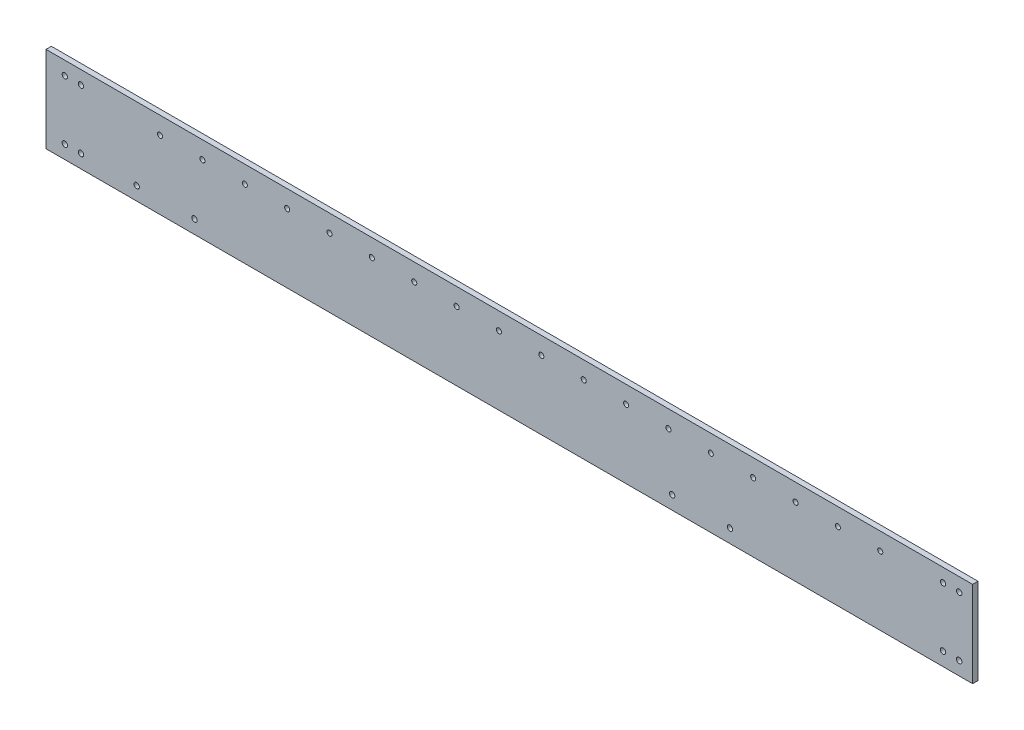
ISO-10303-21;
HEADER;
FILE_DESCRIPTION(('STEP AP214'),'2;1');
FILE_NAME('part.step','',(''),(''),'','','');
FILE_SCHEMA(('AUTOMOTIVE_DESIGN { 1 0 10303 214 1 1 1 1 }'));
ENDSEC;
DATA;
#1=APPLICATION_CONTEXT('core data for automotive mechanical design processes');
#2=APPLICATION_PROTOCOL_DEFINITION('international standard','automotive_design',2000,#1);
#3=PRODUCT_CONTEXT('',#1,'mechanical');
#4=PRODUCT('Part','Part','',(#3));
#5=PRODUCT_RELATED_PRODUCT_CATEGORY('part','',(#4));
#6=PRODUCT_DEFINITION_FORMATION('','',#4);
#7=PRODUCT_DEFINITION_CONTEXT('part definition',#1,'design');
#8=PRODUCT_DEFINITION('design','',#6,#7);
#9=PRODUCT_DEFINITION_SHAPE('','',#8);
#10=(LENGTH_UNIT() NAMED_UNIT(*) SI_UNIT(.MILLI.,.METRE.));
#11=(NAMED_UNIT(*) PLANE_ANGLE_UNIT() SI_UNIT($,.RADIAN.));
#12=(NAMED_UNIT(*) SI_UNIT($,.STERADIAN.) SOLID_ANGLE_UNIT());
#13=UNCERTAINTY_MEASURE_WITH_UNIT(LENGTH_MEASURE(1.E-05),#10,'distance_accuracy_value','');
#14=(GEOMETRIC_REPRESENTATION_CONTEXT(3) GLOBAL_UNCERTAINTY_ASSIGNED_CONTEXT((#13)) GLOBAL_UNIT_ASSIGNED_CONTEXT((#10,
#11,#12)) REPRESENTATION_CONTEXT('',''));
#15=CARTESIAN_POINT('',(0.,0.,0.));
#16=DIRECTION('',(0.,0.,1.));
#17=DIRECTION('',(1.,0.,0.));
#18=AXIS2_PLACEMENT_3D('',#15,#16,#17);
#19=CARTESIAN_POINT('',(546.825,50.8,0.));
#20=DIRECTION('',(0.,0.,1.));
#21=DIRECTION('',(0.,-1.,0.));
#22=AXIS2_PLACEMENT_3D('',#19,#20,#21);
#23=PLANE('',#22);
#24=CARTESIAN_POINT('',(292.325,40.5749999999986,0.));
#25=DIRECTION('',(0.,0.,1.));
#26=DIRECTION('',(1.,0.,0.));
#27=AXIS2_PLACEMENT_3D('',#24,#25,#26);
#28=CIRCLE('',#27,1.50000000000002);
#29=CARTESIAN_POINT('',(293.825,40.5749999999986,0.));
#30=VERTEX_POINT('',#29);
#31=EDGE_CURVE('E167',#30,#30,#28,.T.);
#32=ORIENTED_EDGE('',*,*,#31,.T.);
#33=EDGE_LOOP('',(#32));
#34=FACE_BOUND('',#33,.T.);
#35=CARTESIAN_POINT('',(317.325,40.5749999999988,0.));
#36=DIRECTION('',(0.,0.,1.));
#37=DIRECTION('',(1.,0.,0.));
#38=AXIS2_PLACEMENT_3D('',#35,#36,#37);
#39=CIRCLE('',#38,1.50000000000002);
#40=CARTESIAN_POINT('',(318.825,40.5749999999988,0.));
#41=VERTEX_POINT('',#40);
#42=EDGE_CURVE('E174',#41,#41,#39,.T.);
#43=ORIENTED_EDGE('',*,*,#42,.T.);
#44=EDGE_LOOP('',(#43));
#45=FACE_BOUND('',#44,.T.);
#46=CARTESIAN_POINT('',(342.325,40.574999999999,0.));
#47=DIRECTION('',(0.,0.,1.));
#48=DIRECTION('',(1.,0.,0.));
#49=AXIS2_PLACEMENT_3D('',#46,#47,#48);
#50=CIRCLE('',#49,1.50000000000002);
#51=CARTESIAN_POINT('',(343.825,40.574999999999,0.));
#52=VERTEX_POINT('',#51);
#53=EDGE_CURVE('E180',#52,#52,#50,.T.);
#54=ORIENTED_EDGE('',*,*,#53,.T.);
#55=EDGE_LOOP('',(#54));
#56=FACE_BOUND('',#55,.T.);
#57=CARTESIAN_POINT('',(367.325,40.5749999999991,0.));
#58=DIRECTION('',(0.,0.,1.));
#59=DIRECTION('',(1.,0.,0.));
#60=AXIS2_PLACEMENT_3D('',#57,#58,#59);
#61=CIRCLE('',#60,1.50000000000002);
#62=CARTESIAN_POINT('',(368.825,40.5749999999991,0.));
#63=VERTEX_POINT('',#62);
#64=EDGE_CURVE('E186',#63,#63,#61,.T.);
#65=ORIENTED_EDGE('',*,*,#64,.T.);
#66=EDGE_LOOP('',(#65));
#67=FACE_BOUND('',#66,.T.);
#68=CARTESIAN_POINT('',(392.325,40.5749999999993,0.));
#69=DIRECTION('',(0.,0.,1.));
#70=DIRECTION('',(1.,0.,0.));
#71=AXIS2_PLACEMENT_3D('',#68,#69,#70);
#72=CIRCLE('',#71,1.50000000000008);
#73=CARTESIAN_POINT('',(393.825,40.5749999999993,0.));
#74=VERTEX_POINT('',#73);
#75=EDGE_CURVE('E192',#74,#74,#72,.T.);
#76=ORIENTED_EDGE('',*,*,#75,.T.);
#77=EDGE_LOOP('',(#76));
#78=FACE_BOUND('',#77,.T.);
#79=CARTESIAN_POINT('',(417.325,40.5749999999995,0.));
#80=DIRECTION('',(0.,0.,1.));
#81=DIRECTION('',(1.,0.,0.));
#82=AXIS2_PLACEMENT_3D('',#79,#80,#81);
#83=CIRCLE('',#82,1.50000000000002);
#84=CARTESIAN_POINT('',(418.825,40.5749999999995,0.));
#85=VERTEX_POINT('',#84);
#86=EDGE_CURVE('E198',#85,#85,#83,.T.);
#87=ORIENTED_EDGE('',*,*,#86,.T.);
#88=EDGE_LOOP('',(#87));
#89=FACE_BOUND('',#88,.T.);
#90=CARTESIAN_POINT('',(442.325,40.5749999999997,0.));
#91=DIRECTION('',(0.,0.,1.));
#92=DIRECTION('',(1.,0.,0.));
#93=AXIS2_PLACEMENT_3D('',#90,#91,#92);
#94=CIRCLE('',#93,1.50000000000002);
#95=CARTESIAN_POINT('',(443.825,40.5749999999997,0.));
#96=VERTEX_POINT('',#95);
#97=EDGE_CURVE('E204',#96,#96,#94,.T.);
#98=ORIENTED_EDGE('',*,*,#97,.T.);
#99=EDGE_LOOP('',(#98));
#100=FACE_BOUND('',#99,.T.);
#101=CARTESIAN_POINT('',(467.325,40.5749999999998,0.));
#102=DIRECTION('',(0.,0.,1.));
#103=DIRECTION('',(1.,0.,0.));
#104=AXIS2_PLACEMENT_3D('',#101,#102,#103);
#105=CIRCLE('',#104,1.50000000000002);
#106=CARTESIAN_POINT('',(468.825,40.5749999999998,0.));
#107=VERTEX_POINT('',#106);
#108=EDGE_CURVE('E210',#107,#107,#105,.T.);
#109=ORIENTED_EDGE('',*,*,#108,.T.);
#110=EDGE_LOOP('',(#109));
#111=FACE_BOUND('',#110,.T.);
#112=CARTESIAN_POINT('',(538.8875,42.8625,0.));
#113=DIRECTION('',(0.,0.,1.));
#114=DIRECTION('',(1.,0.,0.));
#115=AXIS2_PLACEMENT_3D('',#112,#113,#114);
#116=CIRCLE('',#115,1.58750000000004);
#117=CARTESIAN_POINT('',(540.475,42.8625,0.));
#118=VERTEX_POINT('',#117);
#119=EDGE_CURVE('E138',#118,#118,#116,.T.);
#120=ORIENTED_EDGE('',*,*,#119,.T.);
#121=EDGE_LOOP('',(#120));
#122=FACE_BOUND('',#121,.T.);
#123=CARTESIAN_POINT('',(529.3625,42.8625,0.));
#124=DIRECTION('',(0.,0.,1.));
#125=DIRECTION('',(1.,0.,0.));
#126=AXIS2_PLACEMENT_3D('',#123,#124,#125);
#127=CIRCLE('',#126,1.58750000000004);
#128=CARTESIAN_POINT('',(530.95,42.8625,0.));
#129=VERTEX_POINT('',#128);
#130=EDGE_CURVE('E132',#129,#129,#127,.T.);
#131=ORIENTED_EDGE('',*,*,#130,.T.);
#132=EDGE_LOOP('',(#131));
#133=FACE_BOUND('',#132,.T.);
#134=CARTESIAN_POINT('',(20.6375,42.8625,0.));
#135=DIRECTION('',(0.,0.,1.));
#136=DIRECTION('',(1.,0.,0.));
#137=AXIS2_PLACEMENT_3D('',#134,#135,#136);
#138=CIRCLE('',#137,1.5875);
#139=CARTESIAN_POINT('',(22.225,42.8625,0.));
#140=VERTEX_POINT('',#139);
#141=EDGE_CURVE('E126',#140,#140,#138,.T.);
#142=ORIENTED_EDGE('',*,*,#141,.T.);
#143=EDGE_LOOP('',(#142));
#144=FACE_BOUND('',#143,.T.);
#145=CARTESIAN_POINT('',(11.1125,7.9375,0.));
#146=DIRECTION('',(0.,0.,1.));
#147=DIRECTION('',(1.,0.,0.));
#148=AXIS2_PLACEMENT_3D('',#145,#146,#147);
#149=CIRCLE('',#148,1.5875);
#150=CARTESIAN_POINT('',(12.7,7.9375,0.));
#151=VERTEX_POINT('',#150);
#152=EDGE_CURVE('E119',#151,#151,#149,.T.);
#153=ORIENTED_EDGE('',*,*,#152,.T.);
#154=EDGE_LOOP('',(#153));
#155=FACE_BOUND('',#154,.T.);
#156=CARTESIAN_POINT('',(492.325,40.575,0.));
#157=DIRECTION('',(0.,0.,1.));
#158=DIRECTION('',(1.,0.,0.));
#159=AXIS2_PLACEMENT_3D('',#156,#157,#158);
#160=CIRCLE('',#159,1.50000000000002);
#161=CARTESIAN_POINT('',(493.825,40.575,0.));
#162=VERTEX_POINT('',#161);
#163=EDGE_CURVE('E155',#162,#162,#160,.T.);
#164=ORIENTED_EDGE('',*,*,#163,.T.);
#165=EDGE_LOOP('',(#164));
#166=FACE_BOUND('',#165,.T.);
#167=CARTESIAN_POINT('',(538.8875,7.9375,0.));
#168=DIRECTION('',(0.,0.,1.));
#169=DIRECTION('',(1.,0.,0.));
#170=AXIS2_PLACEMENT_3D('',#167,#168,#169);
#171=CIRCLE('',#170,1.58750000000005);
#172=CARTESIAN_POINT('',(540.475,7.9375,0.));
#173=VERTEX_POINT('',#172);
#174=EDGE_CURVE('E162',#173,#173,#171,.T.);
#175=ORIENTED_EDGE('',*,*,#174,.T.);
#176=EDGE_LOOP('',(#175));
#177=FACE_BOUND('',#176,.T.);
#178=CARTESIAN_POINT('',(529.3625,7.9375,0.));
#179=DIRECTION('',(0.,0.,1.));
#180=DIRECTION('',(1.,0.,0.));
#181=AXIS2_PLACEMENT_3D('',#178,#179,#180);
#182=CIRCLE('',#181,1.58750000000005);
#183=CARTESIAN_POINT('',(530.95,7.9375,0.));
#184=VERTEX_POINT('',#183);
#185=EDGE_CURVE('E143',#184,#184,#182,.T.);
#186=ORIENTED_EDGE('',*,*,#185,.T.);
#187=EDGE_LOOP('',(#186));
#188=FACE_BOUND('',#187,.T.);
#189=CARTESIAN_POINT('',(20.6375,7.9375,0.));
#190=DIRECTION('',(0.,0.,1.));
#191=DIRECTION('',(1.,0.,0.));
#192=AXIS2_PLACEMENT_3D('',#189,#190,#191);
#193=CIRCLE('',#192,1.5875);
#194=CARTESIAN_POINT('',(22.225,7.9375,0.));
#195=VERTEX_POINT('',#194);
#196=EDGE_CURVE('E150',#195,#195,#193,.T.);
#197=ORIENTED_EDGE('',*,*,#196,.T.);
#198=EDGE_LOOP('',(#197));
#199=FACE_BOUND('',#198,.T.);
#200=CARTESIAN_POINT('',(403.6375,7.9375,0.));
#201=DIRECTION('',(0.,0.,1.));
#202=DIRECTION('',(1.,0.,0.));
#203=AXIS2_PLACEMENT_3D('',#200,#201,#202);
#204=CIRCLE('',#203,1.58750000000004);
#205=CARTESIAN_POINT('',(405.225,7.9375,0.));
#206=VERTEX_POINT('',#205);
#207=EDGE_CURVE('E263',#206,#206,#204,.T.);
#208=ORIENTED_EDGE('',*,*,#207,.T.);
#209=EDGE_LOOP('',(#208));
#210=FACE_BOUND('',#209,.T.);
#211=CARTESIAN_POINT('',(87.6375,7.9375,0.));
#212=DIRECTION('',(0.,0.,1.));
#213=DIRECTION('',(1.,0.,0.));
#214=AXIS2_PLACEMENT_3D('',#211,#212,#213);
#215=CIRCLE('',#214,1.5875);
#216=CARTESIAN_POINT('',(89.225,7.9375,0.));
#217=VERTEX_POINT('',#216);
#218=EDGE_CURVE('E269',#217,#217,#215,.T.);
#219=ORIENTED_EDGE('',*,*,#218,.T.);
#220=EDGE_LOOP('',(#219));
#221=FACE_BOUND('',#220,.T.);
#222=CARTESIAN_POINT('',(369.5125,7.9375,0.));
#223=DIRECTION('',(0.,0.,1.));
#224=DIRECTION('',(1.,0.,0.));
#225=AXIS2_PLACEMENT_3D('',#222,#223,#224);
#226=CIRCLE('',#225,1.58750000000004);
#227=CARTESIAN_POINT('',(371.1,7.9375,0.));
#228=VERTEX_POINT('',#227);
#229=EDGE_CURVE('E275',#228,#228,#226,.T.);
#230=ORIENTED_EDGE('',*,*,#229,.T.);
#231=EDGE_LOOP('',(#230));
#232=FACE_BOUND('',#231,.T.);
#233=CARTESIAN_POINT('',(67.3249999999996,40.574999999997,0.));
#234=DIRECTION('',(0.,0.,1.));
#235=DIRECTION('',(1.,0.,0.));
#236=AXIS2_PLACEMENT_3D('',#233,#234,#235);
#237=CIRCLE('',#236,1.50000000000003);
#238=CARTESIAN_POINT('',(68.8249999999997,40.574999999997,0.));
#239=VERTEX_POINT('',#238);
#240=EDGE_CURVE('E281',#239,#239,#237,.T.);
#241=ORIENTED_EDGE('',*,*,#240,.T.);
#242=EDGE_LOOP('',(#241));
#243=FACE_BOUND('',#242,.T.);
#244=CARTESIAN_POINT('',(92.3249999999997,40.5749999999972,0.));
#245=DIRECTION('',(0.,0.,1.));
#246=DIRECTION('',(1.,0.,0.));
#247=AXIS2_PLACEMENT_3D('',#244,#245,#246);
#248=CIRCLE('',#247,1.50000000000003);
#249=CARTESIAN_POINT('',(93.8249999999997,40.5749999999972,0.));
#250=VERTEX_POINT('',#249);
#251=EDGE_CURVE('E287',#250,#250,#248,.T.);
#252=ORIENTED_EDGE('',*,*,#251,.T.);
#253=EDGE_LOOP('',(#252));
#254=FACE_BOUND('',#253,.T.);
#255=CARTESIAN_POINT('',(167.325,40.5749999999977,0.));
#256=DIRECTION('',(0.,0.,1.));
#257=DIRECTION('',(1.,0.,0.));
#258=AXIS2_PLACEMENT_3D('',#255,#256,#257);
#259=CIRCLE('',#258,1.50000000000003);
#260=CARTESIAN_POINT('',(168.825,40.5749999999977,0.));
#261=VERTEX_POINT('',#260);
#262=EDGE_CURVE('E222',#261,#261,#259,.T.);
#263=ORIENTED_EDGE('',*,*,#262,.T.);
#264=EDGE_LOOP('',(#263));
#265=FACE_BOUND('',#264,.T.);
#266=CARTESIAN_POINT('',(53.5125,7.9375,0.));
#267=DIRECTION('',(0.,0.,1.));
#268=DIRECTION('',(1.,0.,0.));
#269=AXIS2_PLACEMENT_3D('',#266,#267,#268);
#270=CIRCLE('',#269,1.5875);
#271=CARTESIAN_POINT('',(55.1,7.9375,0.));
#272=VERTEX_POINT('',#271);
#273=EDGE_CURVE('E215',#272,#272,#270,.T.);
#274=ORIENTED_EDGE('',*,*,#273,.T.);
#275=EDGE_LOOP('',(#274));
#276=FACE_BOUND('',#275,.T.);
#277=CARTESIAN_POINT('',(142.325,40.5749999999976,0.));
#278=DIRECTION('',(0.,0.,1.));
#279=DIRECTION('',(1.,0.,0.));
#280=AXIS2_PLACEMENT_3D('',#277,#278,#279);
#281=CIRCLE('',#280,1.50000000000003);
#282=CARTESIAN_POINT('',(143.825,40.5749999999976,0.));
#283=VERTEX_POINT('',#282);
#284=EDGE_CURVE('E236',#283,#283,#281,.T.);
#285=ORIENTED_EDGE('',*,*,#284,.T.);
#286=EDGE_LOOP('',(#285));
#287=FACE_BOUND('',#286,.T.);
#288=CARTESIAN_POINT('',(117.325,40.5749999999974,0.));
#289=DIRECTION('',(0.,0.,1.));
#290=DIRECTION('',(1.,0.,0.));
#291=AXIS2_PLACEMENT_3D('',#288,#289,#290);
#292=CIRCLE('',#291,1.50000000000003);
#293=CARTESIAN_POINT('',(118.825,40.5749999999974,0.));
#294=VERTEX_POINT('',#293);
#295=EDGE_CURVE('E229',#294,#294,#292,.T.);
#296=ORIENTED_EDGE('',*,*,#295,.T.);
#297=EDGE_LOOP('',(#296));
#298=FACE_BOUND('',#297,.T.);
#299=CARTESIAN_POINT('',(192.325,40.5749999999979,0.));
#300=DIRECTION('',(0.,0.,1.));
#301=DIRECTION('',(1.,0.,0.));
#302=AXIS2_PLACEMENT_3D('',#299,#300,#301);
#303=CIRCLE('',#302,1.50000000000003);
#304=CARTESIAN_POINT('',(193.825,40.5749999999979,0.));
#305=VERTEX_POINT('',#304);
#306=EDGE_CURVE('E228',#305,#305,#303,.T.);
#307=ORIENTED_EDGE('',*,*,#306,.T.);
#308=EDGE_LOOP('',(#307));
#309=FACE_BOUND('',#308,.T.);
#310=CARTESIAN_POINT('',(217.325,40.5749999999981,0.));
#311=DIRECTION('',(0.,0.,1.));
#312=DIRECTION('',(1.,0.,0.));
#313=AXIS2_PLACEMENT_3D('',#310,#311,#312);
#314=CIRCLE('',#313,1.50000000000003);
#315=CARTESIAN_POINT('',(218.825,40.5749999999981,0.));
#316=VERTEX_POINT('',#315);
#317=EDGE_CURVE('E246',#316,#316,#314,.T.);
#318=ORIENTED_EDGE('',*,*,#317,.T.);
#319=EDGE_LOOP('',(#318));
#320=FACE_BOUND('',#319,.T.);
#321=CARTESIAN_POINT('',(242.325,40.5749999999983,0.));
#322=DIRECTION('',(0.,0.,1.));
#323=DIRECTION('',(1.,0.,0.));
#324=AXIS2_PLACEMENT_3D('',#321,#322,#323);
#325=CIRCLE('',#324,1.50000000000003);
#326=CARTESIAN_POINT('',(243.825,40.5749999999983,0.));
#327=VERTEX_POINT('',#326);
#328=EDGE_CURVE('E252',#327,#327,#325,.T.);
#329=ORIENTED_EDGE('',*,*,#328,.T.);
#330=EDGE_LOOP('',(#329));
#331=FACE_BOUND('',#330,.T.);
#332=CARTESIAN_POINT('',(267.325,40.5749999999984,0.));
#333=DIRECTION('',(0.,0.,1.));
#334=DIRECTION('',(1.,0.,0.));
#335=AXIS2_PLACEMENT_3D('',#332,#333,#334);
#336=CIRCLE('',#335,1.50000000000002);
#337=CARTESIAN_POINT('',(268.825,40.5749999999984,0.));
#338=VERTEX_POINT('',#337);
#339=EDGE_CURVE('E258',#338,#338,#336,.T.);
#340=ORIENTED_EDGE('',*,*,#339,.T.);
#341=EDGE_LOOP('',(#340));
#342=FACE_BOUND('',#341,.T.);
#343=CARTESIAN_POINT('',(11.1125,42.8625,0.));
#344=DIRECTION('',(0.,0.,1.));
#345=DIRECTION('',(1.,0.,0.));
#346=AXIS2_PLACEMENT_3D('',#343,#344,#345);
#347=CIRCLE('',#346,1.5875);
#348=CARTESIAN_POINT('',(12.7,42.8625,0.));
#349=VERTEX_POINT('',#348);
#350=EDGE_CURVE('E102',#349,#349,#347,.T.);
#351=ORIENTED_EDGE('',*,*,#350,.T.);
#352=EDGE_LOOP('',(#351));
#353=FACE_BOUND('',#352,.T.);
#354=DIRECTION('',(0.,1.,0.));
#355=VECTOR('',#354,1.);
#356=CARTESIAN_POINT('',(0.,50.8,0.));
#357=LINE('',#356,#355);
#358=CARTESIAN_POINT('',(0.,0.,0.));
#359=VERTEX_POINT('',#358);
#360=CARTESIAN_POINT('',(0.,50.8,0.));
#361=VERTEX_POINT('',#360);
#362=EDGE_CURVE('E99',#359,#361,#357,.T.);
#363=ORIENTED_EDGE('',*,*,#362,.T.);
#364=DIRECTION('',(-1.,0.,0.));
#365=VECTOR('',#364,1.);
#366=CARTESIAN_POINT('',(546.825,50.8,0.));
#367=LINE('',#366,#365);
#368=CARTESIAN_POINT('',(546.825,50.8,0.));
#369=VERTEX_POINT('',#368);
#370=EDGE_CURVE('E11',#369,#361,#367,.T.);
#371=ORIENTED_EDGE('',*,*,#370,.F.);
#372=DIRECTION('',(0.,1.,0.));
#373=VECTOR('',#372,1.);
#374=CARTESIAN_POINT('',(546.825,50.8,0.));
#375=LINE('',#374,#373);
#376=CARTESIAN_POINT('',(546.825,0.,0.));
#377=VERTEX_POINT('',#376);
#378=EDGE_CURVE('E87',#377,#369,#375,.T.);
#379=ORIENTED_EDGE('',*,*,#378,.F.);
#380=DIRECTION('',(-1.,0.,0.));
#381=VECTOR('',#380,1.);
#382=CARTESIAN_POINT('',(546.825,0.,0.));
#383=LINE('',#382,#381);
#384=EDGE_CURVE('E95',#377,#359,#383,.T.);
#385=ORIENTED_EDGE('',*,*,#384,.T.);
#386=EDGE_LOOP('',(#363,#371,#379,#385));
#387=FACE_BOUND('',#386,.T.);
#388=ADVANCED_FACE('F36',(#34,#45,#56,#67,#78,#89,#100,#111,#122,#133,#144,#155,#166,#177,#188,
#199,#210,#221,#232,#243,#254,#265,#276,#287,#298,#309,#320,#331,#342,#353,#387),#23,.F.);
#389=CARTESIAN_POINT('',(546.825,50.8,3.17499999999999));
#390=DIRECTION('',(0.,-1.,0.));
#391=DIRECTION('',(0.,0.,-1.));
#392=AXIS2_PLACEMENT_3D('',#389,#390,#391);
#393=PLANE('',#392);
#394=DIRECTION('',(0.,0.,1.));
#395=VECTOR('',#394,1.);
#396=CARTESIAN_POINT('',(0.,50.8,3.17499999999999));
#397=LINE('',#396,#395);
#398=CARTESIAN_POINT('',(0.,50.8,3.17499999999999));
#399=VERTEX_POINT('',#398);
#400=EDGE_CURVE('E91',#361,#399,#397,.T.);
#401=ORIENTED_EDGE('',*,*,#400,.T.);
#402=DIRECTION('',(-1.,0.,0.));
#403=VECTOR('',#402,1.);
#404=CARTESIAN_POINT('',(546.825,50.8,3.17499999999999));
#405=LINE('',#404,#403);
#406=CARTESIAN_POINT('',(546.825,50.8,3.17499999999999));
#407=VERTEX_POINT('',#406);
#408=EDGE_CURVE('E44',#407,#399,#405,.T.);
#409=ORIENTED_EDGE('',*,*,#408,.F.);
#410=DIRECTION('',(0.,0.,1.));
#411=VECTOR('',#410,1.);
#412=CARTESIAN_POINT('',(546.825,50.8,3.17499999999999));
#413=LINE('',#412,#411);
#414=EDGE_CURVE('E82',#369,#407,#413,.T.);
#415=ORIENTED_EDGE('',*,*,#414,.F.);
#416=ORIENTED_EDGE('',*,*,#370,.T.);
#417=EDGE_LOOP('',(#401,#409,#415,#416));
#418=FACE_BOUND('',#417,.T.);
#419=ADVANCED_FACE('F90',(#418),#393,.F.);
#420=CARTESIAN_POINT('',(546.825,0.,3.175));
#421=DIRECTION('',(0.,0.,-1.));
#422=DIRECTION('',(0.,1.,0.));
#423=AXIS2_PLACEMENT_3D('',#420,#421,#422);
#424=PLANE('',#423);
#425=CARTESIAN_POINT('',(292.325,40.5749999999986,3.175));
#426=DIRECTION('',(0.,0.,1.));
#427=DIRECTION('',(1.,0.,0.));
#428=AXIS2_PLACEMENT_3D('',#425,#426,#427);
#429=CIRCLE('',#428,1.50000000000002);
#430=CARTESIAN_POINT('',(293.825,40.5749999999986,3.175));
#431=VERTEX_POINT('',#430);
#432=EDGE_CURVE('E170',#431,#431,#429,.T.);
#433=ORIENTED_EDGE('',*,*,#432,.F.);
#434=EDGE_LOOP('',(#433));
#435=FACE_BOUND('',#434,.T.);
#436=CARTESIAN_POINT('',(317.325,40.5749999999988,3.175));
#437=DIRECTION('',(0.,0.,1.));
#438=DIRECTION('',(1.,0.,0.));
#439=AXIS2_PLACEMENT_3D('',#436,#437,#438);
#440=CIRCLE('',#439,1.50000000000002);
#441=CARTESIAN_POINT('',(318.825,40.5749999999988,3.175));
#442=VERTEX_POINT('',#441);
#443=EDGE_CURVE('E177',#442,#442,#440,.T.);
#444=ORIENTED_EDGE('',*,*,#443,.F.);
#445=EDGE_LOOP('',(#444));
#446=FACE_BOUND('',#445,.T.);
#447=CARTESIAN_POINT('',(342.325,40.574999999999,3.175));
#448=DIRECTION('',(0.,0.,1.));
#449=DIRECTION('',(1.,0.,0.));
#450=AXIS2_PLACEMENT_3D('',#447,#448,#449);
#451=CIRCLE('',#450,1.50000000000002);
#452=CARTESIAN_POINT('',(343.825,40.574999999999,3.175));
#453=VERTEX_POINT('',#452);
#454=EDGE_CURVE('E183',#453,#453,#451,.T.);
#455=ORIENTED_EDGE('',*,*,#454,.F.);
#456=EDGE_LOOP('',(#455));
#457=FACE_BOUND('',#456,.T.);
#458=CARTESIAN_POINT('',(367.325,40.5749999999991,3.175));
#459=DIRECTION('',(0.,0.,1.));
#460=DIRECTION('',(1.,0.,0.));
#461=AXIS2_PLACEMENT_3D('',#458,#459,#460);
#462=CIRCLE('',#461,1.50000000000002);
#463=CARTESIAN_POINT('',(368.825,40.5749999999991,3.175));
#464=VERTEX_POINT('',#463);
#465=EDGE_CURVE('E189',#464,#464,#462,.T.);
#466=ORIENTED_EDGE('',*,*,#465,.F.);
#467=EDGE_LOOP('',(#466));
#468=FACE_BOUND('',#467,.T.);
#469=CARTESIAN_POINT('',(392.325,40.5749999999993,3.175));
#470=DIRECTION('',(0.,0.,1.));
#471=DIRECTION('',(1.,0.,0.));
#472=AXIS2_PLACEMENT_3D('',#469,#470,#471);
#473=CIRCLE('',#472,1.50000000000008);
#474=CARTESIAN_POINT('',(393.825,40.5749999999993,3.175));
#475=VERTEX_POINT('',#474);
#476=EDGE_CURVE('E195',#475,#475,#473,.T.);
#477=ORIENTED_EDGE('',*,*,#476,.F.);
#478=EDGE_LOOP('',(#477));
#479=FACE_BOUND('',#478,.T.);
#480=CARTESIAN_POINT('',(417.325,40.5749999999995,3.175));
#481=DIRECTION('',(0.,0.,1.));
#482=DIRECTION('',(1.,0.,0.));
#483=AXIS2_PLACEMENT_3D('',#480,#481,#482);
#484=CIRCLE('',#483,1.50000000000002);
#485=CARTESIAN_POINT('',(418.825,40.5749999999995,3.175));
#486=VERTEX_POINT('',#485);
#487=EDGE_CURVE('E201',#486,#486,#484,.T.);
#488=ORIENTED_EDGE('',*,*,#487,.F.);
#489=EDGE_LOOP('',(#488));
#490=FACE_BOUND('',#489,.T.);
#491=CARTESIAN_POINT('',(442.325,40.5749999999997,3.175));
#492=DIRECTION('',(0.,0.,1.));
#493=DIRECTION('',(1.,0.,0.));
#494=AXIS2_PLACEMENT_3D('',#491,#492,#493);
#495=CIRCLE('',#494,1.50000000000002);
#496=CARTESIAN_POINT('',(443.825,40.5749999999997,3.175));
#497=VERTEX_POINT('',#496);
#498=EDGE_CURVE('E207',#497,#497,#495,.T.);
#499=ORIENTED_EDGE('',*,*,#498,.F.);
#500=EDGE_LOOP('',(#499));
#501=FACE_BOUND('',#500,.T.);
#502=CARTESIAN_POINT('',(467.325,40.5749999999998,3.175));
#503=DIRECTION('',(0.,0.,1.));
#504=DIRECTION('',(1.,0.,0.));
#505=AXIS2_PLACEMENT_3D('',#502,#503,#504);
#506=CIRCLE('',#505,1.50000000000002);
#507=CARTESIAN_POINT('',(468.825,40.5749999999998,3.175));
#508=VERTEX_POINT('',#507);
#509=EDGE_CURVE('E159',#508,#508,#506,.T.);
#510=ORIENTED_EDGE('',*,*,#509,.F.);
#511=EDGE_LOOP('',(#510));
#512=FACE_BOUND('',#511,.T.);
#513=CARTESIAN_POINT('',(538.8875,42.8625,3.175));
#514=DIRECTION('',(0.,0.,1.));
#515=DIRECTION('',(1.,0.,0.));
#516=AXIS2_PLACEMENT_3D('',#513,#514,#515);
#517=CIRCLE('',#516,1.58750000000004);
#518=CARTESIAN_POINT('',(540.475,42.8625,3.175));
#519=VERTEX_POINT('',#518);
#520=EDGE_CURVE('E116',#519,#519,#517,.T.);
#521=ORIENTED_EDGE('',*,*,#520,.F.);
#522=EDGE_LOOP('',(#521));
#523=FACE_BOUND('',#522,.T.);
#524=CARTESIAN_POINT('',(529.3625,42.8625,3.175));
#525=DIRECTION('',(0.,0.,1.));
#526=DIRECTION('',(1.,0.,0.));
#527=AXIS2_PLACEMENT_3D('',#524,#525,#526);
#528=CIRCLE('',#527,1.58750000000004);
#529=CARTESIAN_POINT('',(530.95,42.8625,3.175));
#530=VERTEX_POINT('',#529);
#531=EDGE_CURVE('E135',#530,#530,#528,.T.);
#532=ORIENTED_EDGE('',*,*,#531,.F.);
#533=EDGE_LOOP('',(#532));
#534=FACE_BOUND('',#533,.T.);
#535=CARTESIAN_POINT('',(20.6375,42.8625,3.175));
#536=DIRECTION('',(0.,0.,1.));
#537=DIRECTION('',(1.,0.,0.));
#538=AXIS2_PLACEMENT_3D('',#535,#536,#537);
#539=CIRCLE('',#538,1.5875);
#540=CARTESIAN_POINT('',(22.225,42.8625,3.175));
#541=VERTEX_POINT('',#540);
#542=EDGE_CURVE('E129',#541,#541,#539,.T.);
#543=ORIENTED_EDGE('',*,*,#542,.F.);
#544=EDGE_LOOP('',(#543));
#545=FACE_BOUND('',#544,.T.);
#546=CARTESIAN_POINT('',(11.1125,7.9375,3.175));
#547=DIRECTION('',(0.,0.,1.));
#548=DIRECTION('',(1.,0.,0.));
#549=AXIS2_PLACEMENT_3D('',#546,#547,#548);
#550=CIRCLE('',#549,1.5875);
#551=CARTESIAN_POINT('',(12.7,7.9375,3.175));
#552=VERTEX_POINT('',#551);
#553=EDGE_CURVE('E122',#552,#552,#550,.T.);
#554=ORIENTED_EDGE('',*,*,#553,.F.);
#555=EDGE_LOOP('',(#554));
#556=FACE_BOUND('',#555,.T.);
#557=CARTESIAN_POINT('',(492.325,40.575,3.175));
#558=DIRECTION('',(0.,0.,1.));
#559=DIRECTION('',(1.,0.,0.));
#560=AXIS2_PLACEMENT_3D('',#557,#558,#559);
#561=CIRCLE('',#560,1.50000000000002);
#562=CARTESIAN_POINT('',(493.825,40.575,3.175));
#563=VERTEX_POINT('',#562);
#564=EDGE_CURVE('E158',#563,#563,#561,.T.);
#565=ORIENTED_EDGE('',*,*,#564,.F.);
#566=EDGE_LOOP('',(#565));
#567=FACE_BOUND('',#566,.T.);
#568=CARTESIAN_POINT('',(538.8875,7.9375,3.175));
#569=DIRECTION('',(0.,0.,1.));
#570=DIRECTION('',(1.,0.,0.));
#571=AXIS2_PLACEMENT_3D('',#568,#569,#570);
#572=CIRCLE('',#571,1.58750000000005);
#573=CARTESIAN_POINT('',(540.475,7.9375,3.175));
#574=VERTEX_POINT('',#573);
#575=EDGE_CURVE('E147',#574,#574,#572,.T.);
#576=ORIENTED_EDGE('',*,*,#575,.F.);
#577=EDGE_LOOP('',(#576));
#578=FACE_BOUND('',#577,.T.);
#579=CARTESIAN_POINT('',(529.3625,7.9375,3.175));
#580=DIRECTION('',(0.,0.,1.));
#581=DIRECTION('',(1.,0.,0.));
#582=AXIS2_PLACEMENT_3D('',#579,#580,#581);
#583=CIRCLE('',#582,1.58750000000005);
#584=CARTESIAN_POINT('',(530.95,7.9375,3.175));
#585=VERTEX_POINT('',#584);
#586=EDGE_CURVE('E146',#585,#585,#583,.T.);
#587=ORIENTED_EDGE('',*,*,#586,.F.);
#588=EDGE_LOOP('',(#587));
#589=FACE_BOUND('',#588,.T.);
#590=CARTESIAN_POINT('',(20.6375,7.9375,3.175));
#591=DIRECTION('',(0.,0.,1.));
#592=DIRECTION('',(1.,0.,0.));
#593=AXIS2_PLACEMENT_3D('',#590,#591,#592);
#594=CIRCLE('',#593,1.5875);
#595=CARTESIAN_POINT('',(22.225,7.9375,3.175));
#596=VERTEX_POINT('',#595);
#597=EDGE_CURVE('E123',#596,#596,#594,.T.);
#598=ORIENTED_EDGE('',*,*,#597,.F.);
#599=EDGE_LOOP('',(#598));
#600=FACE_BOUND('',#599,.T.);
#601=CARTESIAN_POINT('',(403.6375,7.9375,3.175));
#602=DIRECTION('',(0.,0.,1.));
#603=DIRECTION('',(1.,0.,0.));
#604=AXIS2_PLACEMENT_3D('',#601,#602,#603);
#605=CIRCLE('',#604,1.58750000000004);
#606=CARTESIAN_POINT('',(405.225,7.9375,3.175));
#607=VERTEX_POINT('',#606);
#608=EDGE_CURVE('E266',#607,#607,#605,.T.);
#609=ORIENTED_EDGE('',*,*,#608,.F.);
#610=EDGE_LOOP('',(#609));
#611=FACE_BOUND('',#610,.T.);
#612=CARTESIAN_POINT('',(87.6375,7.9375,3.175));
#613=DIRECTION('',(0.,0.,1.));
#614=DIRECTION('',(1.,0.,0.));
#615=AXIS2_PLACEMENT_3D('',#612,#613,#614);
#616=CIRCLE('',#615,1.5875);
#617=CARTESIAN_POINT('',(89.225,7.9375,3.175));
#618=VERTEX_POINT('',#617);
#619=EDGE_CURVE('E272',#618,#618,#616,.T.);
#620=ORIENTED_EDGE('',*,*,#619,.F.);
#621=EDGE_LOOP('',(#620));
#622=FACE_BOUND('',#621,.T.);
#623=CARTESIAN_POINT('',(369.5125,7.9375,3.175));
#624=DIRECTION('',(0.,0.,1.));
#625=DIRECTION('',(1.,0.,0.));
#626=AXIS2_PLACEMENT_3D('',#623,#624,#625);
#627=CIRCLE('',#626,1.58750000000004);
#628=CARTESIAN_POINT('',(371.1,7.9375,3.175));
#629=VERTEX_POINT('',#628);
#630=EDGE_CURVE('E278',#629,#629,#627,.T.);
#631=ORIENTED_EDGE('',*,*,#630,.F.);
#632=EDGE_LOOP('',(#631));
#633=FACE_BOUND('',#632,.T.);
#634=CARTESIAN_POINT('',(67.3249999999996,40.574999999997,3.175));
#635=DIRECTION('',(0.,0.,1.));
#636=DIRECTION('',(1.,0.,0.));
#637=AXIS2_PLACEMENT_3D('',#634,#635,#636);
#638=CIRCLE('',#637,1.50000000000003);
#639=CARTESIAN_POINT('',(68.8249999999997,40.574999999997,3.175));
#640=VERTEX_POINT('',#639);
#641=EDGE_CURVE('E284',#640,#640,#638,.T.);
#642=ORIENTED_EDGE('',*,*,#641,.F.);
#643=EDGE_LOOP('',(#642));
#644=FACE_BOUND('',#643,.T.);
#645=CARTESIAN_POINT('',(92.3249999999997,40.5749999999972,3.175));
#646=DIRECTION('',(0.,0.,1.));
#647=DIRECTION('',(1.,0.,0.));
#648=AXIS2_PLACEMENT_3D('',#645,#646,#647);
#649=CIRCLE('',#648,1.50000000000003);
#650=CARTESIAN_POINT('',(93.8249999999997,40.5749999999972,3.175));
#651=VERTEX_POINT('',#650);
#652=EDGE_CURVE('E233',#651,#651,#649,.T.);
#653=ORIENTED_EDGE('',*,*,#652,.F.);
#654=EDGE_LOOP('',(#653));
#655=FACE_BOUND('',#654,.T.);
#656=CARTESIAN_POINT('',(167.325,40.5749999999977,3.175));
#657=DIRECTION('',(0.,0.,1.));
#658=DIRECTION('',(1.,0.,0.));
#659=AXIS2_PLACEMENT_3D('',#656,#657,#658);
#660=CIRCLE('',#659,1.50000000000003);
#661=CARTESIAN_POINT('',(168.825,40.5749999999977,3.175));
#662=VERTEX_POINT('',#661);
#663=EDGE_CURVE('E225',#662,#662,#660,.T.);
#664=ORIENTED_EDGE('',*,*,#663,.F.);
#665=EDGE_LOOP('',(#664));
#666=FACE_BOUND('',#665,.T.);
#667=CARTESIAN_POINT('',(53.5125,7.9375,3.175));
#668=DIRECTION('',(0.,0.,1.));
#669=DIRECTION('',(1.,0.,0.));
#670=AXIS2_PLACEMENT_3D('',#667,#668,#669);
#671=CIRCLE('',#670,1.5875);
#672=CARTESIAN_POINT('',(55.1,7.9375,3.175));
#673=VERTEX_POINT('',#672);
#674=EDGE_CURVE('E218',#673,#673,#671,.T.);
#675=ORIENTED_EDGE('',*,*,#674,.F.);
#676=EDGE_LOOP('',(#675));
#677=FACE_BOUND('',#676,.T.);
#678=CARTESIAN_POINT('',(142.325,40.5749999999976,3.175));
#679=DIRECTION('',(0.,0.,1.));
#680=DIRECTION('',(1.,0.,0.));
#681=AXIS2_PLACEMENT_3D('',#678,#679,#680);
#682=CIRCLE('',#681,1.50000000000003);
#683=CARTESIAN_POINT('',(143.825,40.5749999999976,3.175));
#684=VERTEX_POINT('',#683);
#685=EDGE_CURVE('E219',#684,#684,#682,.T.);
#686=ORIENTED_EDGE('',*,*,#685,.F.);
#687=EDGE_LOOP('',(#686));
#688=FACE_BOUND('',#687,.T.);
#689=CARTESIAN_POINT('',(117.325,40.5749999999974,3.175));
#690=DIRECTION('',(0.,0.,1.));
#691=DIRECTION('',(1.,0.,0.));
#692=AXIS2_PLACEMENT_3D('',#689,#690,#691);
#693=CIRCLE('',#692,1.50000000000003);
#694=CARTESIAN_POINT('',(118.825,40.5749999999974,3.175));
#695=VERTEX_POINT('',#694);
#696=EDGE_CURVE('E232',#695,#695,#693,.T.);
#697=ORIENTED_EDGE('',*,*,#696,.F.);
#698=EDGE_LOOP('',(#697));
#699=FACE_BOUND('',#698,.T.);
#700=CARTESIAN_POINT('',(192.325,40.5749999999979,3.175));
#701=DIRECTION('',(0.,0.,1.));
#702=DIRECTION('',(1.,0.,0.));
#703=AXIS2_PLACEMENT_3D('',#700,#701,#702);
#704=CIRCLE('',#703,1.50000000000003);
#705=CARTESIAN_POINT('',(193.825,40.5749999999979,3.175));
#706=VERTEX_POINT('',#705);
#707=EDGE_CURVE('E243',#706,#706,#704,.T.);
#708=ORIENTED_EDGE('',*,*,#707,.F.);
#709=EDGE_LOOP('',(#708));
#710=FACE_BOUND('',#709,.T.);
#711=CARTESIAN_POINT('',(217.325,40.5749999999981,3.175));
#712=DIRECTION('',(0.,0.,1.));
#713=DIRECTION('',(1.,0.,0.));
#714=AXIS2_PLACEMENT_3D('',#711,#712,#713);
#715=CIRCLE('',#714,1.50000000000003);
#716=CARTESIAN_POINT('',(218.825,40.5749999999981,3.175));
#717=VERTEX_POINT('',#716);
#718=EDGE_CURVE('E249',#717,#717,#715,.T.);
#719=ORIENTED_EDGE('',*,*,#718,.F.);
#720=EDGE_LOOP('',(#719));
#721=FACE_BOUND('',#720,.T.);
#722=CARTESIAN_POINT('',(242.325,40.5749999999983,3.175));
#723=DIRECTION('',(0.,0.,1.));
#724=DIRECTION('',(1.,0.,0.));
#725=AXIS2_PLACEMENT_3D('',#722,#723,#724);
#726=CIRCLE('',#725,1.50000000000003);
#727=CARTESIAN_POINT('',(243.825,40.5749999999983,3.175));
#728=VERTEX_POINT('',#727);
#729=EDGE_CURVE('E255',#728,#728,#726,.T.);
#730=ORIENTED_EDGE('',*,*,#729,.F.);
#731=EDGE_LOOP('',(#730));
#732=FACE_BOUND('',#731,.T.);
#733=CARTESIAN_POINT('',(267.325,40.5749999999984,3.175));
#734=DIRECTION('',(0.,0.,1.));
#735=DIRECTION('',(1.,0.,0.));
#736=AXIS2_PLACEMENT_3D('',#733,#734,#735);
#737=CIRCLE('',#736,1.50000000000002);
#738=CARTESIAN_POINT('',(268.825,40.5749999999984,3.175));
#739=VERTEX_POINT('',#738);
#740=EDGE_CURVE('E171',#739,#739,#737,.T.);
#741=ORIENTED_EDGE('',*,*,#740,.F.);
#742=EDGE_LOOP('',(#741));
#743=FACE_BOUND('',#742,.T.);
#744=CARTESIAN_POINT('',(11.1125,42.8625,3.175));
#745=DIRECTION('',(0.,0.,1.));
#746=DIRECTION('',(1.,0.,0.));
#747=AXIS2_PLACEMENT_3D('',#744,#745,#746);
#748=CIRCLE('',#747,1.5875);
#749=CARTESIAN_POINT('',(12.7,42.8625,3.175));
#750=VERTEX_POINT('',#749);
#751=EDGE_CURVE('E113',#750,#750,#748,.T.);
#752=ORIENTED_EDGE('',*,*,#751,.F.);
#753=EDGE_LOOP('',(#752));
#754=FACE_BOUND('',#753,.T.);
#755=DIRECTION('',(0.,-1.,0.));
#756=VECTOR('',#755,1.);
#757=CARTESIAN_POINT('',(0.,0.,3.175));
#758=LINE('',#757,#756);
#759=CARTESIAN_POINT('',(0.,0.,3.175));
#760=VERTEX_POINT('',#759);
#761=EDGE_CURVE('E69',#399,#760,#758,.T.);
#762=ORIENTED_EDGE('',*,*,#761,.T.);
#763=DIRECTION('',(-1.,0.,0.));
#764=VECTOR('',#763,1.);
#765=CARTESIAN_POINT('',(546.825,0.,3.175));
#766=LINE('',#765,#764);
#767=CARTESIAN_POINT('',(546.825,0.,3.175));
#768=VERTEX_POINT('',#767);
#769=EDGE_CURVE('E92',#768,#760,#766,.T.);
#770=ORIENTED_EDGE('',*,*,#769,.F.);
#771=DIRECTION('',(0.,-1.,0.));
#772=VECTOR('',#771,1.);
#773=CARTESIAN_POINT('',(546.825,0.,3.175));
#774=LINE('',#773,#772);
#775=EDGE_CURVE('E85',#407,#768,#774,.T.);
#776=ORIENTED_EDGE('',*,*,#775,.F.);
#777=ORIENTED_EDGE('',*,*,#408,.T.);
#778=EDGE_LOOP('',(#762,#770,#776,#777));
#779=FACE_BOUND('',#778,.T.);
#780=ADVANCED_FACE('F93',(#435,#446,#457,#468,#479,#490,#501,#512,#523,#534,#545,#556,#567,#578,
#589,#600,#611,#622,#633,#644,#655,#666,#677,#688,#699,#710,#721,#732,#743,#754,#779),#424,.F.);
#781=CARTESIAN_POINT('',(546.825,0.,0.));
#782=DIRECTION('',(0.,1.,0.));
#783=DIRECTION('',(0.,0.,1.));
#784=AXIS2_PLACEMENT_3D('',#781,#782,#783);
#785=PLANE('',#784);
#786=DIRECTION('',(0.,0.,-1.));
#787=VECTOR('',#786,1.);
#788=CARTESIAN_POINT('',(0.,0.,0.));
#789=LINE('',#788,#787);
#790=EDGE_CURVE('E75',#760,#359,#789,.T.);
#791=ORIENTED_EDGE('',*,*,#790,.T.);
#792=ORIENTED_EDGE('',*,*,#384,.F.);
#793=DIRECTION('',(0.,0.,-1.));
#794=VECTOR('',#793,1.);
#795=CARTESIAN_POINT('',(546.825,0.,0.));
#796=LINE('',#795,#794);
#797=EDGE_CURVE('E52',#768,#377,#796,.T.);
#798=ORIENTED_EDGE('',*,*,#797,.F.);
#799=ORIENTED_EDGE('',*,*,#769,.T.);
#800=EDGE_LOOP('',(#791,#792,#798,#799));
#801=FACE_BOUND('',#800,.T.);
#802=ADVANCED_FACE('F107',(#801),#785,.F.);
#803=CARTESIAN_POINT('',(546.825,0.,0.));
#804=DIRECTION('',(-1.,0.,0.));
#805=DIRECTION('',(0.,0.,1.));
#806=AXIS2_PLACEMENT_3D('',#803,#804,#805);
#807=PLANE('',#806);
#808=ORIENTED_EDGE('',*,*,#378,.T.);
#809=ORIENTED_EDGE('',*,*,#414,.T.);
#810=ORIENTED_EDGE('',*,*,#775,.T.);
#811=ORIENTED_EDGE('',*,*,#797,.T.);
#812=EDGE_LOOP('',(#808,#809,#810,#811));
#813=FACE_BOUND('',#812,.T.);
#814=ADVANCED_FACE('F83',(#813),#807,.F.);
#815=CARTESIAN_POINT('',(0.,0.,0.));
#816=DIRECTION('',(-1.,0.,0.));
#817=DIRECTION('',(0.,0.,1.));
#818=AXIS2_PLACEMENT_3D('',#815,#816,#817);
#819=PLANE('',#818);
#820=ORIENTED_EDGE('',*,*,#362,.F.);
#821=ORIENTED_EDGE('',*,*,#790,.F.);
#822=ORIENTED_EDGE('',*,*,#761,.F.);
#823=ORIENTED_EDGE('',*,*,#400,.F.);
#824=EDGE_LOOP('',(#820,#821,#822,#823));
#825=FACE_BOUND('',#824,.T.);
#826=ADVANCED_FACE('F110',(#825),#819,.T.);
#827=CARTESIAN_POINT('',(11.1125,42.8625,0.));
#828=DIRECTION('',(0.,0.,1.));
#829=DIRECTION('',(1.,0.,0.));
#830=AXIS2_PLACEMENT_3D('',#827,#828,#829);
#831=CYLINDRICAL_SURFACE('',#830,1.5875);
#832=ORIENTED_EDGE('',*,*,#350,.F.);
#833=EDGE_LOOP('',(#832));
#834=FACE_BOUND('',#833,.T.);
#835=ORIENTED_EDGE('',*,*,#751,.T.);
#836=EDGE_LOOP('',(#835));
#837=FACE_BOUND('',#836,.T.);
#838=ADVANCED_FACE('F317',(#834,#837),#831,.F.);
#839=CARTESIAN_POINT('',(267.325,40.5749999999984,0.));
#840=DIRECTION('',(0.,0.,1.));
#841=DIRECTION('',(1.,0.,0.));
#842=AXIS2_PLACEMENT_3D('',#839,#840,#841);
#843=CYLINDRICAL_SURFACE('',#842,1.50000000000002);
#844=ORIENTED_EDGE('',*,*,#339,.F.);
#845=EDGE_LOOP('',(#844));
#846=FACE_BOUND('',#845,.T.);
#847=ORIENTED_EDGE('',*,*,#740,.T.);
#848=EDGE_LOOP('',(#847));
#849=FACE_BOUND('',#848,.T.);
#850=ADVANCED_FACE('F319',(#846,#849),#843,.F.);
#851=CARTESIAN_POINT('',(242.325,40.5749999999983,0.));
#852=DIRECTION('',(0.,0.,1.));
#853=DIRECTION('',(1.,0.,0.));
#854=AXIS2_PLACEMENT_3D('',#851,#852,#853);
#855=CYLINDRICAL_SURFACE('',#854,1.50000000000003);
#856=ORIENTED_EDGE('',*,*,#328,.F.);
#857=EDGE_LOOP('',(#856));
#858=FACE_BOUND('',#857,.T.);
#859=ORIENTED_EDGE('',*,*,#729,.T.);
#860=EDGE_LOOP('',(#859));
#861=FACE_BOUND('',#860,.T.);
#862=ADVANCED_FACE('F326',(#858,#861),#855,.F.);
#863=CARTESIAN_POINT('',(217.325,40.5749999999981,0.));
#864=DIRECTION('',(0.,0.,1.));
#865=DIRECTION('',(1.,0.,0.));
#866=AXIS2_PLACEMENT_3D('',#863,#864,#865);
#867=CYLINDRICAL_SURFACE('',#866,1.50000000000003);
#868=ORIENTED_EDGE('',*,*,#317,.F.);
#869=EDGE_LOOP('',(#868));
#870=FACE_BOUND('',#869,.T.);
#871=ORIENTED_EDGE('',*,*,#718,.T.);
#872=EDGE_LOOP('',(#871));
#873=FACE_BOUND('',#872,.T.);
#874=ADVANCED_FACE('F400',(#870,#873),#867,.F.);
#875=CARTESIAN_POINT('',(192.325,40.5749999999979,0.));
#876=DIRECTION('',(0.,0.,1.));
#877=DIRECTION('',(1.,0.,0.));
#878=AXIS2_PLACEMENT_3D('',#875,#876,#877);
#879=CYLINDRICAL_SURFACE('',#878,1.50000000000003);
#880=ORIENTED_EDGE('',*,*,#306,.F.);
#881=EDGE_LOOP('',(#880));
#882=FACE_BOUND('',#881,.T.);
#883=ORIENTED_EDGE('',*,*,#707,.T.);
#884=EDGE_LOOP('',(#883));
#885=FACE_BOUND('',#884,.T.);
#886=ADVANCED_FACE('F405',(#882,#885),#879,.F.);
#887=CARTESIAN_POINT('',(117.325,40.5749999999974,0.));
#888=DIRECTION('',(0.,0.,1.));
#889=DIRECTION('',(1.,0.,0.));
#890=AXIS2_PLACEMENT_3D('',#887,#888,#889);
#891=CYLINDRICAL_SURFACE('',#890,1.50000000000003);
#892=ORIENTED_EDGE('',*,*,#295,.F.);
#893=EDGE_LOOP('',(#892));
#894=FACE_BOUND('',#893,.T.);
#895=ORIENTED_EDGE('',*,*,#696,.T.);
#896=EDGE_LOOP('',(#895));
#897=FACE_BOUND('',#896,.T.);
#898=ADVANCED_FACE('F412',(#894,#897),#891,.F.);
#899=CARTESIAN_POINT('',(142.325,40.5749999999976,0.));
#900=DIRECTION('',(0.,0.,1.));
#901=DIRECTION('',(1.,0.,0.));
#902=AXIS2_PLACEMENT_3D('',#899,#900,#901);
#903=CYLINDRICAL_SURFACE('',#902,1.50000000000003);
#904=ORIENTED_EDGE('',*,*,#284,.F.);
#905=EDGE_LOOP('',(#904));
#906=FACE_BOUND('',#905,.T.);
#907=ORIENTED_EDGE('',*,*,#685,.T.);
#908=EDGE_LOOP('',(#907));
#909=FACE_BOUND('',#908,.T.);
#910=ADVANCED_FACE('F414',(#906,#909),#903,.F.);
#911=CARTESIAN_POINT('',(53.5125,7.9375,0.));
#912=DIRECTION('',(0.,0.,1.));
#913=DIRECTION('',(1.,0.,0.));
#914=AXIS2_PLACEMENT_3D('',#911,#912,#913);
#915=CYLINDRICAL_SURFACE('',#914,1.5875);
#916=ORIENTED_EDGE('',*,*,#273,.F.);
#917=EDGE_LOOP('',(#916));
#918=FACE_BOUND('',#917,.T.);
#919=ORIENTED_EDGE('',*,*,#674,.T.);
#920=EDGE_LOOP('',(#919));
#921=FACE_BOUND('',#920,.T.);
#922=ADVANCED_FACE('F417',(#918,#921),#915,.F.);
#923=CARTESIAN_POINT('',(167.325,40.5749999999977,0.));
#924=DIRECTION('',(0.,0.,1.));
#925=DIRECTION('',(1.,0.,0.));
#926=AXIS2_PLACEMENT_3D('',#923,#924,#925);
#927=CYLINDRICAL_SURFACE('',#926,1.50000000000003);
#928=ORIENTED_EDGE('',*,*,#262,.F.);
#929=EDGE_LOOP('',(#928));
#930=FACE_BOUND('',#929,.T.);
#931=ORIENTED_EDGE('',*,*,#663,.T.);
#932=EDGE_LOOP('',(#931));
#933=FACE_BOUND('',#932,.T.);
#934=ADVANCED_FACE('F422',(#930,#933),#927,.F.);
#935=CARTESIAN_POINT('',(92.3249999999997,40.5749999999972,0.));
#936=DIRECTION('',(0.,0.,1.));
#937=DIRECTION('',(1.,0.,0.));
#938=AXIS2_PLACEMENT_3D('',#935,#936,#937);
#939=CYLINDRICAL_SURFACE('',#938,1.50000000000003);
#940=ORIENTED_EDGE('',*,*,#251,.F.);
#941=EDGE_LOOP('',(#940));
#942=FACE_BOUND('',#941,.T.);
#943=ORIENTED_EDGE('',*,*,#652,.T.);
#944=EDGE_LOOP('',(#943));
#945=FACE_BOUND('',#944,.T.);
#946=ADVANCED_FACE('F293',(#942,#945),#939,.F.);
#947=CARTESIAN_POINT('',(67.3249999999996,40.574999999997,0.));
#948=DIRECTION('',(0.,0.,1.));
#949=DIRECTION('',(1.,0.,0.));
#950=AXIS2_PLACEMENT_3D('',#947,#948,#949);
#951=CYLINDRICAL_SURFACE('',#950,1.50000000000003);
#952=ORIENTED_EDGE('',*,*,#240,.F.);
#953=EDGE_LOOP('',(#952));
#954=FACE_BOUND('',#953,.T.);
#955=ORIENTED_EDGE('',*,*,#641,.T.);
#956=EDGE_LOOP('',(#955));
#957=FACE_BOUND('',#956,.T.);
#958=ADVANCED_FACE('F514',(#954,#957),#951,.F.);
#959=CARTESIAN_POINT('',(369.5125,7.9375,0.));
#960=DIRECTION('',(0.,0.,1.));
#961=DIRECTION('',(1.,0.,0.));
#962=AXIS2_PLACEMENT_3D('',#959,#960,#961);
#963=CYLINDRICAL_SURFACE('',#962,1.58750000000004);
#964=ORIENTED_EDGE('',*,*,#229,.F.);
#965=EDGE_LOOP('',(#964));
#966=FACE_BOUND('',#965,.T.);
#967=ORIENTED_EDGE('',*,*,#630,.T.);
#968=EDGE_LOOP('',(#967));
#969=FACE_BOUND('',#968,.T.);
#970=ADVANCED_FACE('F516',(#966,#969),#963,.F.);
#971=CARTESIAN_POINT('',(87.6375,7.9375,0.));
#972=DIRECTION('',(0.,0.,1.));
#973=DIRECTION('',(1.,0.,0.));
#974=AXIS2_PLACEMENT_3D('',#971,#972,#973);
#975=CYLINDRICAL_SURFACE('',#974,1.5875);
#976=ORIENTED_EDGE('',*,*,#218,.F.);
#977=EDGE_LOOP('',(#976));
#978=FACE_BOUND('',#977,.T.);
#979=ORIENTED_EDGE('',*,*,#619,.T.);
#980=EDGE_LOOP('',(#979));
#981=FACE_BOUND('',#980,.T.);
#982=ADVANCED_FACE('F523',(#978,#981),#975,.F.);
#983=CARTESIAN_POINT('',(403.6375,7.9375,0.));
#984=DIRECTION('',(0.,0.,1.));
#985=DIRECTION('',(1.,0.,0.));
#986=AXIS2_PLACEMENT_3D('',#983,#984,#985);
#987=CYLINDRICAL_SURFACE('',#986,1.58750000000004);
#988=ORIENTED_EDGE('',*,*,#207,.F.);
#989=EDGE_LOOP('',(#988));
#990=FACE_BOUND('',#989,.T.);
#991=ORIENTED_EDGE('',*,*,#608,.T.);
#992=EDGE_LOOP('',(#991));
#993=FACE_BOUND('',#992,.T.);
#994=ADVANCED_FACE('F475',(#990,#993),#987,.F.);
#995=CARTESIAN_POINT('',(20.6375,7.9375,0.));
#996=DIRECTION('',(0.,0.,1.));
#997=DIRECTION('',(1.,0.,0.));
#998=AXIS2_PLACEMENT_3D('',#995,#996,#997);
#999=CYLINDRICAL_SURFACE('',#998,1.5875);
#1000=ORIENTED_EDGE('',*,*,#196,.F.);
#1001=EDGE_LOOP('',(#1000));
#1002=FACE_BOUND('',#1001,.T.);
#1003=ORIENTED_EDGE('',*,*,#597,.T.);
#1004=EDGE_LOOP('',(#1003));
#1005=FACE_BOUND('',#1004,.T.);
#1006=ADVANCED_FACE('F472',(#1002,#1005),#999,.F.);
#1007=CARTESIAN_POINT('',(529.3625,7.9375,0.));
#1008=DIRECTION('',(0.,0.,1.));
#1009=DIRECTION('',(1.,0.,0.));
#1010=AXIS2_PLACEMENT_3D('',#1007,#1008,#1009);
#1011=CYLINDRICAL_SURFACE('',#1010,1.58750000000005);
#1012=ORIENTED_EDGE('',*,*,#185,.F.);
#1013=EDGE_LOOP('',(#1012));
#1014=FACE_BOUND('',#1013,.T.);
#1015=ORIENTED_EDGE('',*,*,#586,.T.);
#1016=EDGE_LOOP('',(#1015));
#1017=FACE_BOUND('',#1016,.T.);
#1018=ADVANCED_FACE('F466',(#1014,#1017),#1011,.F.);
#1019=CARTESIAN_POINT('',(538.8875,7.9375,0.));
#1020=DIRECTION('',(0.,0.,1.));
#1021=DIRECTION('',(1.,0.,0.));
#1022=AXIS2_PLACEMENT_3D('',#1019,#1020,#1021);
#1023=CYLINDRICAL_SURFACE('',#1022,1.58750000000005);
#1024=ORIENTED_EDGE('',*,*,#174,.F.);
#1025=EDGE_LOOP('',(#1024));
#1026=FACE_BOUND('',#1025,.T.);
#1027=ORIENTED_EDGE('',*,*,#575,.T.);
#1028=EDGE_LOOP('',(#1027));
#1029=FACE_BOUND('',#1028,.T.);
#1030=ADVANCED_FACE('F462',(#1026,#1029),#1023,.F.);
#1031=CARTESIAN_POINT('',(492.325,40.575,0.));
#1032=DIRECTION('',(0.,0.,1.));
#1033=DIRECTION('',(1.,0.,0.));
#1034=AXIS2_PLACEMENT_3D('',#1031,#1032,#1033);
#1035=CYLINDRICAL_SURFACE('',#1034,1.50000000000002);
#1036=ORIENTED_EDGE('',*,*,#163,.F.);
#1037=EDGE_LOOP('',(#1036));
#1038=FACE_BOUND('',#1037,.T.);
#1039=ORIENTED_EDGE('',*,*,#564,.T.);
#1040=EDGE_LOOP('',(#1039));
#1041=FACE_BOUND('',#1040,.T.);
#1042=ADVANCED_FACE('F465',(#1038,#1041),#1035,.F.);
#1043=CARTESIAN_POINT('',(11.1125,7.9375,0.));
#1044=DIRECTION('',(0.,0.,1.));
#1045=DIRECTION('',(1.,0.,0.));
#1046=AXIS2_PLACEMENT_3D('',#1043,#1044,#1045);
#1047=CYLINDRICAL_SURFACE('',#1046,1.5875);
#1048=ORIENTED_EDGE('',*,*,#152,.F.);
#1049=EDGE_LOOP('',(#1048));
#1050=FACE_BOUND('',#1049,.T.);
#1051=ORIENTED_EDGE('',*,*,#553,.T.);
#1052=EDGE_LOOP('',(#1051));
#1053=FACE_BOUND('',#1052,.T.);
#1054=ADVANCED_FACE('F470',(#1050,#1053),#1047,.F.);
#1055=CARTESIAN_POINT('',(20.6375,42.8625,0.));
#1056=DIRECTION('',(0.,0.,1.));
#1057=DIRECTION('',(1.,0.,0.));
#1058=AXIS2_PLACEMENT_3D('',#1055,#1056,#1057);
#1059=CYLINDRICAL_SURFACE('',#1058,1.5875);
#1060=ORIENTED_EDGE('',*,*,#141,.F.);
#1061=EDGE_LOOP('',(#1060));
#1062=FACE_BOUND('',#1061,.T.);
#1063=ORIENTED_EDGE('',*,*,#542,.T.);
#1064=EDGE_LOOP('',(#1063));
#1065=FACE_BOUND('',#1064,.T.);
#1066=ADVANCED_FACE('F486',(#1062,#1065),#1059,.F.);
#1067=CARTESIAN_POINT('',(529.3625,42.8625,0.));
#1068=DIRECTION('',(0.,0.,1.));
#1069=DIRECTION('',(1.,0.,0.));
#1070=AXIS2_PLACEMENT_3D('',#1067,#1068,#1069);
#1071=CYLINDRICAL_SURFACE('',#1070,1.58750000000004);
#1072=ORIENTED_EDGE('',*,*,#130,.F.);
#1073=EDGE_LOOP('',(#1072));
#1074=FACE_BOUND('',#1073,.T.);
#1075=ORIENTED_EDGE('',*,*,#531,.T.);
#1076=EDGE_LOOP('',(#1075));
#1077=FACE_BOUND('',#1076,.T.);
#1078=ADVANCED_FACE('F482',(#1074,#1077),#1071,.F.);
#1079=CARTESIAN_POINT('',(538.8875,42.8625,0.));
#1080=DIRECTION('',(0.,0.,1.));
#1081=DIRECTION('',(1.,0.,0.));
#1082=AXIS2_PLACEMENT_3D('',#1079,#1080,#1081);
#1083=CYLINDRICAL_SURFACE('',#1082,1.58750000000004);
#1084=ORIENTED_EDGE('',*,*,#119,.F.);
#1085=EDGE_LOOP('',(#1084));
#1086=FACE_BOUND('',#1085,.T.);
#1087=ORIENTED_EDGE('',*,*,#520,.T.);
#1088=EDGE_LOOP('',(#1087));
#1089=FACE_BOUND('',#1088,.T.);
#1090=ADVANCED_FACE('F433',(#1086,#1089),#1083,.F.);
#1091=CARTESIAN_POINT('',(467.325,40.5749999999998,0.));
#1092=DIRECTION('',(0.,0.,1.));
#1093=DIRECTION('',(1.,0.,0.));
#1094=AXIS2_PLACEMENT_3D('',#1091,#1092,#1093);
#1095=CYLINDRICAL_SURFACE('',#1094,1.50000000000002);
#1096=ORIENTED_EDGE('',*,*,#108,.F.);
#1097=EDGE_LOOP('',(#1096));
#1098=FACE_BOUND('',#1097,.T.);
#1099=ORIENTED_EDGE('',*,*,#509,.T.);
#1100=EDGE_LOOP('',(#1099));
#1101=FACE_BOUND('',#1100,.T.);
#1102=ADVANCED_FACE('F429',(#1098,#1101),#1095,.F.);
#1103=CARTESIAN_POINT('',(442.325,40.5749999999997,0.));
#1104=DIRECTION('',(0.,0.,1.));
#1105=DIRECTION('',(1.,0.,0.));
#1106=AXIS2_PLACEMENT_3D('',#1103,#1104,#1105);
#1107=CYLINDRICAL_SURFACE('',#1106,1.50000000000002);
#1108=ORIENTED_EDGE('',*,*,#97,.F.);
#1109=EDGE_LOOP('',(#1108));
#1110=FACE_BOUND('',#1109,.T.);
#1111=ORIENTED_EDGE('',*,*,#498,.T.);
#1112=EDGE_LOOP('',(#1111));
#1113=FACE_BOUND('',#1112,.T.);
#1114=ADVANCED_FACE('F432',(#1110,#1113),#1107,.F.);
#1115=CARTESIAN_POINT('',(417.325,40.5749999999995,0.));
#1116=DIRECTION('',(0.,0.,1.));
#1117=DIRECTION('',(1.,0.,0.));
#1118=AXIS2_PLACEMENT_3D('',#1115,#1116,#1117);
#1119=CYLINDRICAL_SURFACE('',#1118,1.50000000000002);
#1120=ORIENTED_EDGE('',*,*,#86,.F.);
#1121=EDGE_LOOP('',(#1120));
#1122=FACE_BOUND('',#1121,.T.);
#1123=ORIENTED_EDGE('',*,*,#487,.T.);
#1124=EDGE_LOOP('',(#1123));
#1125=FACE_BOUND('',#1124,.T.);
#1126=ADVANCED_FACE('F437',(#1122,#1125),#1119,.F.);
#1127=CARTESIAN_POINT('',(392.325,40.5749999999993,0.));
#1128=DIRECTION('',(0.,0.,1.));
#1129=DIRECTION('',(1.,0.,0.));
#1130=AXIS2_PLACEMENT_3D('',#1127,#1128,#1129);
#1131=CYLINDRICAL_SURFACE('',#1130,1.50000000000008);
#1132=ORIENTED_EDGE('',*,*,#75,.F.);
#1133=EDGE_LOOP('',(#1132));
#1134=FACE_BOUND('',#1133,.T.);
#1135=ORIENTED_EDGE('',*,*,#476,.T.);
#1136=EDGE_LOOP('',(#1135));
#1137=FACE_BOUND('',#1136,.T.);
#1138=ADVANCED_FACE('F441',(#1134,#1137),#1131,.F.);
#1139=CARTESIAN_POINT('',(367.325,40.5749999999991,0.));
#1140=DIRECTION('',(0.,0.,1.));
#1141=DIRECTION('',(1.,0.,0.));
#1142=AXIS2_PLACEMENT_3D('',#1139,#1140,#1141);
#1143=CYLINDRICAL_SURFACE('',#1142,1.50000000000002);
#1144=ORIENTED_EDGE('',*,*,#64,.F.);
#1145=EDGE_LOOP('',(#1144));
#1146=FACE_BOUND('',#1145,.T.);
#1147=ORIENTED_EDGE('',*,*,#465,.T.);
#1148=EDGE_LOOP('',(#1147));
#1149=FACE_BOUND('',#1148,.T.);
#1150=ADVANCED_FACE('F445',(#1146,#1149),#1143,.F.);
#1151=CARTESIAN_POINT('',(342.325,40.574999999999,0.));
#1152=DIRECTION('',(0.,0.,1.));
#1153=DIRECTION('',(1.,0.,0.));
#1154=AXIS2_PLACEMENT_3D('',#1151,#1152,#1153);
#1155=CYLINDRICAL_SURFACE('',#1154,1.50000000000002);
#1156=ORIENTED_EDGE('',*,*,#53,.F.);
#1157=EDGE_LOOP('',(#1156));
#1158=FACE_BOUND('',#1157,.T.);
#1159=ORIENTED_EDGE('',*,*,#454,.T.);
#1160=EDGE_LOOP('',(#1159));
#1161=FACE_BOUND('',#1160,.T.);
#1162=ADVANCED_FACE('F449',(#1158,#1161),#1155,.F.);
#1163=CARTESIAN_POINT('',(317.325,40.5749999999988,0.));
#1164=DIRECTION('',(0.,0.,1.));
#1165=DIRECTION('',(1.,0.,0.));
#1166=AXIS2_PLACEMENT_3D('',#1163,#1164,#1165);
#1167=CYLINDRICAL_SURFACE('',#1166,1.50000000000002);
#1168=ORIENTED_EDGE('',*,*,#42,.F.);
#1169=EDGE_LOOP('',(#1168));
#1170=FACE_BOUND('',#1169,.T.);
#1171=ORIENTED_EDGE('',*,*,#443,.T.);
#1172=EDGE_LOOP('',(#1171));
#1173=FACE_BOUND('',#1172,.T.);
#1174=ADVANCED_FACE('F453',(#1170,#1173),#1167,.F.);
#1175=CARTESIAN_POINT('',(292.325,40.5749999999986,0.));
#1176=DIRECTION('',(0.,0.,1.));
#1177=DIRECTION('',(1.,0.,0.));
#1178=AXIS2_PLACEMENT_3D('',#1175,#1176,#1177);
#1179=CYLINDRICAL_SURFACE('',#1178,1.50000000000002);
#1180=ORIENTED_EDGE('',*,*,#31,.F.);
#1181=EDGE_LOOP('',(#1180));
#1182=FACE_BOUND('',#1181,.T.);
#1183=ORIENTED_EDGE('',*,*,#432,.T.);
#1184=EDGE_LOOP('',(#1183));
#1185=FACE_BOUND('',#1184,.T.);
#1186=ADVANCED_FACE('F457',(#1182,#1185),#1179,.F.);
#1187=CLOSED_SHELL('',(#388,#419,#780,#802,#814,#826,#838,#850,#862,#874,#886,#898,#910,#922,
#934,#946,#958,#970,#982,#994,#1006,#1018,#1030,#1042,#1054,#1066,#1078,#1090,#1102,#1114,#1126,
#1138,#1150,#1162,#1174,#1186));
#1188=MANIFOLD_SOLID_BREP('B2',#1187);
#1189=ADVANCED_BREP_SHAPE_REPRESENTATION('',(#18,#1188),#14);
#1190=SHAPE_DEFINITION_REPRESENTATION(#9,#1189);
ENDSEC;
END-ISO-10303-21;
